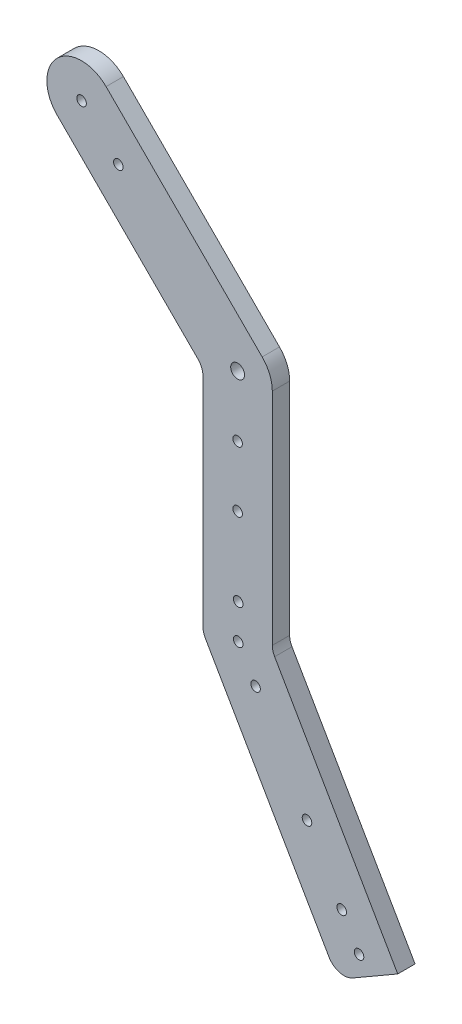
ISO-10303-21;
HEADER;
FILE_DESCRIPTION(('STEP AP214'),'2;1');
FILE_NAME('part.step','',(''),(''),'','','');
FILE_SCHEMA(('AUTOMOTIVE_DESIGN { 1 0 10303 214 1 1 1 1 }'));
ENDSEC;
DATA;
#1=APPLICATION_CONTEXT('core data for automotive mechanical design processes');
#2=APPLICATION_PROTOCOL_DEFINITION('international standard','automotive_design',2000,#1);
#3=PRODUCT_CONTEXT('',#1,'mechanical');
#4=PRODUCT('Part','Part','',(#3));
#5=PRODUCT_RELATED_PRODUCT_CATEGORY('part','',(#4));
#6=PRODUCT_DEFINITION_FORMATION('','',#4);
#7=PRODUCT_DEFINITION_CONTEXT('part definition',#1,'design');
#8=PRODUCT_DEFINITION('design','',#6,#7);
#9=PRODUCT_DEFINITION_SHAPE('','',#8);
#10=(LENGTH_UNIT() NAMED_UNIT(*) SI_UNIT(.MILLI.,.METRE.));
#11=(NAMED_UNIT(*) PLANE_ANGLE_UNIT() SI_UNIT($,.RADIAN.));
#12=(NAMED_UNIT(*) SI_UNIT($,.STERADIAN.) SOLID_ANGLE_UNIT());
#13=UNCERTAINTY_MEASURE_WITH_UNIT(LENGTH_MEASURE(1.E-05),#10,'distance_accuracy_value','');
#14=(GEOMETRIC_REPRESENTATION_CONTEXT(3) GLOBAL_UNCERTAINTY_ASSIGNED_CONTEXT((#13)) GLOBAL_UNIT_ASSIGNED_CONTEXT((#10,
#11,#12)) REPRESENTATION_CONTEXT('',''));
#15=CARTESIAN_POINT('',(0.,0.,0.));
#16=DIRECTION('',(0.,0.,1.));
#17=DIRECTION('',(1.,0.,0.));
#18=AXIS2_PLACEMENT_3D('',#15,#16,#17);
#19=CARTESIAN_POINT('',(0.,0.,10.));
#20=DIRECTION('',(0.,0.,1.));
#21=DIRECTION('',(1.,0.,0.));
#22=AXIS2_PLACEMENT_3D('',#19,#20,#21);
#23=PLANE('',#22);
#24=CARTESIAN_POINT('',(0.340741737109289,145.091301473286,10.));
#25=DIRECTION('',(0.,0.,1.));
#26=DIRECTION('',(1.,0.,0.));
#27=AXIS2_PLACEMENT_3D('',#24,#25,#26);
#28=CIRCLE('',#27,2.75);
#29=CARTESIAN_POINT('',(3.09074173710929,145.091301473286,10.));
#30=VERTEX_POINT('',#29);
#31=EDGE_CURVE('E285',#30,#30,#28,.T.);
#32=ORIENTED_EDGE('',*,*,#31,.F.);
#33=EDGE_LOOP('',(#32));
#34=FACE_BOUND('',#33,.T.);
#35=CARTESIAN_POINT('',(0.340741737109289,125.091301473286,10.));
#36=DIRECTION('',(0.,0.,1.));
#37=DIRECTION('',(1.,0.,0.));
#38=AXIS2_PLACEMENT_3D('',#35,#36,#37);
#39=CIRCLE('',#38,2.75);
#40=CARTESIAN_POINT('',(3.09074173710929,125.091301473286,10.));
#41=VERTEX_POINT('',#40);
#42=EDGE_CURVE('E290',#41,#41,#39,.T.);
#43=ORIENTED_EDGE('',*,*,#42,.F.);
#44=EDGE_LOOP('',(#43));
#45=FACE_BOUND('',#44,.T.);
#46=CARTESIAN_POINT('',(10.3407417371093,107.770793397597,10.));
#47=DIRECTION('',(0.,0.,1.));
#48=DIRECTION('',(1.,0.,0.));
#49=AXIS2_PLACEMENT_3D('',#46,#47,#48);
#50=CIRCLE('',#49,2.75000000000001);
#51=CARTESIAN_POINT('',(13.0907417371093,107.770793397597,10.));
#52=VERTEX_POINT('',#51);
#53=EDGE_CURVE('E293',#52,#52,#50,.T.);
#54=ORIENTED_EDGE('',*,*,#53,.F.);
#55=EDGE_LOOP('',(#54));
#56=FACE_BOUND('',#55,.T.);
#57=CARTESIAN_POINT('',(39.9999999999999,55.7179676972447,10.));
#58=DIRECTION('',(0.,0.,1.));
#59=DIRECTION('',(1.,0.,0.));
#60=AXIS2_PLACEMENT_3D('',#57,#58,#59);
#61=CIRCLE('',#60,2.75);
#62=CARTESIAN_POINT('',(42.7499999999999,55.7179676972447,10.));
#63=VERTEX_POINT('',#62);
#64=EDGE_CURVE('E282',#63,#63,#61,.T.);
#65=ORIENTED_EDGE('',*,*,#64,.F.);
#66=EDGE_LOOP('',(#65));
#67=FACE_BOUND('',#66,.T.);
#68=CARTESIAN_POINT('',(-89.9999999999998,350.,10.));
#69=DIRECTION('',(0.,0.,1.));
#70=DIRECTION('',(1.,0.,0.));
#71=AXIS2_PLACEMENT_3D('',#68,#69,#70);
#72=CIRCLE('',#71,2.75000000000001);
#73=CARTESIAN_POINT('',(-87.2499999999998,350.,10.));
#74=VERTEX_POINT('',#73);
#75=EDGE_CURVE('E277',#74,#74,#72,.T.);
#76=ORIENTED_EDGE('',*,*,#75,.F.);
#77=EDGE_LOOP('',(#76));
#78=FACE_BOUND('',#77,.T.);
#79=CARTESIAN_POINT('',(-68.7867965644034,328.786796564403,10.));
#80=DIRECTION('',(0.,0.,1.));
#81=DIRECTION('',(1.,0.,0.));
#82=AXIS2_PLACEMENT_3D('',#79,#80,#81);
#83=CIRCLE('',#82,2.75000000000001);
#84=CARTESIAN_POINT('',(-66.0367965644034,328.786796564403,10.));
#85=VERTEX_POINT('',#84);
#86=EDGE_CURVE('E270',#85,#85,#83,.T.);
#87=ORIENTED_EDGE('',*,*,#86,.F.);
#88=EDGE_LOOP('',(#87));
#89=FACE_BOUND('',#88,.T.);
#90=CARTESIAN_POINT('',(59.9999999999999,21.0769515458671,10.));
#91=DIRECTION('',(0.,0.,1.));
#92=DIRECTION('',(1.,0.,0.));
#93=AXIS2_PLACEMENT_3D('',#90,#91,#92);
#94=CIRCLE('',#93,2.75000000000002);
#95=CARTESIAN_POINT('',(62.7499999999999,21.0769515458671,10.));
#96=VERTEX_POINT('',#95);
#97=EDGE_CURVE('E169',#96,#96,#94,.T.);
#98=ORIENTED_EDGE('',*,*,#97,.F.);
#99=EDGE_LOOP('',(#98));
#100=FACE_BOUND('',#99,.T.);
#101=CARTESIAN_POINT('',(70.,3.7564434701784,10.));
#102=DIRECTION('',(0.,0.,1.));
#103=DIRECTION('',(1.,0.,0.));
#104=AXIS2_PLACEMENT_3D('',#101,#102,#103);
#105=CIRCLE('',#104,2.75000000000008);
#106=CARTESIAN_POINT('',(72.7500000000001,3.7564434701784,10.));
#107=VERTEX_POINT('',#106);
#108=EDGE_CURVE('E164',#107,#107,#105,.T.);
#109=ORIENTED_EDGE('',*,*,#108,.F.);
#110=EDGE_LOOP('',(#109));
#111=FACE_BOUND('',#110,.T.);
#112=CARTESIAN_POINT('',(0.,190.,10.));
#113=DIRECTION('',(0.,0.,1.));
#114=DIRECTION('',(1.,0.,0.));
#115=AXIS2_PLACEMENT_3D('',#112,#113,#114);
#116=CIRCLE('',#115,2.75);
#117=CARTESIAN_POINT('',(2.75000000000001,190.,10.));
#118=VERTEX_POINT('',#117);
#119=EDGE_CURVE('E177',#118,#118,#116,.T.);
#120=ORIENTED_EDGE('',*,*,#119,.F.);
#121=EDGE_LOOP('',(#120));
#122=FACE_BOUND('',#121,.T.);
#123=CARTESIAN_POINT('',(0.,225.,10.));
#124=DIRECTION('',(0.,0.,1.));
#125=DIRECTION('',(1.,0.,0.));
#126=AXIS2_PLACEMENT_3D('',#123,#124,#125);
#127=CIRCLE('',#126,2.75);
#128=CARTESIAN_POINT('',(2.75,225.,10.));
#129=VERTEX_POINT('',#128);
#130=EDGE_CURVE('E172',#129,#129,#127,.T.);
#131=ORIENTED_EDGE('',*,*,#130,.F.);
#132=EDGE_LOOP('',(#131));
#133=FACE_BOUND('',#132,.T.);
#134=CARTESIAN_POINT('',(0.,260.,10.));
#135=DIRECTION('',(0.,0.,1.));
#136=DIRECTION('',(1.,0.,0.));
#137=AXIS2_PLACEMENT_3D('',#134,#135,#136);
#138=CIRCLE('',#137,4.);
#139=CARTESIAN_POINT('',(4.,260.,10.));
#140=VERTEX_POINT('',#139);
#141=EDGE_CURVE('E176',#140,#140,#138,.T.);
#142=ORIENTED_EDGE('',*,*,#141,.F.);
#143=EDGE_LOOP('',(#142));
#144=FACE_BOUND('',#143,.T.);
#145=DIRECTION('',(-0.707106781186548,0.707106781186548,0.));
#146=VECTOR('',#145,1.);
#147=CARTESIAN_POINT('',(144.142135623731,144.142135623731,10.));
#148=LINE('',#147,#146);
#149=CARTESIAN_POINT('',(14.142135623731,274.142135623731,10.));
#150=VERTEX_POINT('',#149);
#151=CARTESIAN_POINT('',(-75.8578643762689,364.142135623731,10.));
#152=VERTEX_POINT('',#151);
#153=EDGE_CURVE('E154',#150,#152,#148,.T.);
#154=ORIENTED_EDGE('',*,*,#153,.T.);
#155=CARTESIAN_POINT('',(-89.9999999999998,350.,10.));
#156=DIRECTION('',(0.,0.,1.));
#157=DIRECTION('',(1.,0.,0.));
#158=AXIS2_PLACEMENT_3D('',#155,#156,#157);
#159=CIRCLE('',#158,19.9999999999999);
#160=CARTESIAN_POINT('',(-104.142135623731,335.857864376269,10.));
#161=VERTEX_POINT('',#160);
#162=EDGE_CURVE('E132',#152,#161,#159,.T.);
#163=ORIENTED_EDGE('',*,*,#162,.T.);
#164=DIRECTION('',(-0.707106781186548,0.707106781186548,0.));
#165=VECTOR('',#164,1.);
#166=CARTESIAN_POINT('',(115.857864376269,115.857864376269,10.));
#167=LINE('',#166,#165);
#168=CARTESIAN_POINT('',(-22.9289321881345,254.644660940673,10.));
#169=VERTEX_POINT('',#168);
#170=EDGE_CURVE('E157',#169,#161,#167,.T.);
#171=ORIENTED_EDGE('',*,*,#170,.F.);
#172=CARTESIAN_POINT('',(-30.,247.573593128807,10.));
#173=DIRECTION('',(0.,0.,1.));
#174=DIRECTION('',(1.,0.,0.));
#175=AXIS2_PLACEMENT_3D('',#172,#173,#174);
#176=CIRCLE('',#175,10.);
#177=CARTESIAN_POINT('',(-20.,247.573593128807,10.));
#178=VERTEX_POINT('',#177);
#179=EDGE_CURVE('E43',#169,#178,#176,.F.);
#180=ORIENTED_EDGE('',*,*,#179,.T.);
#181=DIRECTION('',(0.,1.,0.));
#182=VECTOR('',#181,1.);
#183=CARTESIAN_POINT('',(-20.,0.,10.));
#184=LINE('',#183,#182);
#185=CARTESIAN_POINT('',(-20.,122.320508075689,10.));
#186=VERTEX_POINT('',#185);
#187=EDGE_CURVE('E207',#186,#178,#184,.T.);
#188=ORIENTED_EDGE('',*,*,#187,.F.);
#189=CARTESIAN_POINT('',(-10.,122.320508075689,10.));
#190=DIRECTION('',(0.,0.,1.));
#191=DIRECTION('',(1.,0.,0.));
#192=AXIS2_PLACEMENT_3D('',#189,#190,#191);
#193=CIRCLE('',#192,10.);
#194=CARTESIAN_POINT('',(-18.6602540378444,117.320508075689,10.));
#195=VERTEX_POINT('',#194);
#196=EDGE_CURVE('E237',#186,#195,#193,.T.);
#197=ORIENTED_EDGE('',*,*,#196,.T.);
#198=DIRECTION('',(0.499999999999995,-0.866025403784442,0.));
#199=VECTOR('',#198,1.);
#200=CARTESIAN_POINT('',(36.8060796608382,21.2499999999994,10.));
#201=LINE('',#200,#199);
#202=CARTESIAN_POINT('',(52.6794919243104,-6.24355652982175,10.));
#203=VERTEX_POINT('',#202);
#204=EDGE_CURVE('E209',#195,#203,#201,.T.);
#205=ORIENTED_EDGE('',*,*,#204,.T.);
#206=CARTESIAN_POINT('',(61.3397459621549,-1.2435565298218,10.));
#207=DIRECTION('',(0.,0.,1.));
#208=DIRECTION('',(1.,0.,0.));
#209=AXIS2_PLACEMENT_3D('',#206,#207,#208);
#210=CIRCLE('',#209,10.);
#211=CARTESIAN_POINT('',(66.3397459621548,-9.90381056766621,10.));
#212=VERTEX_POINT('',#211);
#213=EDGE_CURVE('E239',#203,#212,#210,.T.);
#214=ORIENTED_EDGE('',*,*,#213,.T.);
#215=DIRECTION('',(-0.866025403784442,-0.499999999999995,0.));
#216=VECTOR('',#215,1.);
#217=CARTESIAN_POINT('',(20.8734122634722,-36.1538105676656,10.));
#218=LINE('',#217,#216);
#219=CARTESIAN_POINT('',(92.3205080756881,5.09618943233364,10.));
#220=VERTEX_POINT('',#219);
#221=EDGE_CURVE('E199',#220,#212,#218,.T.);
#222=ORIENTED_EDGE('',*,*,#221,.F.);
#223=DIRECTION('',(0.499999999999995,-0.866025403784442,0.));
#224=VECTOR('',#223,1.);
#225=CARTESIAN_POINT('',(71.4470958122159,41.2499999999993,10.));
#226=LINE('',#225,#224);
#227=CARTESIAN_POINT('',(21.3397459621556,128.038475772934,10.));
#228=VERTEX_POINT('',#227);
#229=EDGE_CURVE('E202',#228,#220,#226,.T.);
#230=ORIENTED_EDGE('',*,*,#229,.F.);
#231=CARTESIAN_POINT('',(30.,133.038475772934,10.));
#232=DIRECTION('',(0.,0.,1.));
#233=DIRECTION('',(1.,0.,0.));
#234=AXIS2_PLACEMENT_3D('',#231,#232,#233);
#235=CIRCLE('',#234,10.);
#236=CARTESIAN_POINT('',(20.,133.038475772934,10.));
#237=VERTEX_POINT('',#236);
#238=EDGE_CURVE('E250',#228,#237,#235,.F.);
#239=ORIENTED_EDGE('',*,*,#238,.T.);
#240=DIRECTION('',(0.,1.,0.));
#241=VECTOR('',#240,1.);
#242=CARTESIAN_POINT('',(20.,0.,10.));
#243=LINE('',#242,#241);
#244=CARTESIAN_POINT('',(20.,260.,10.));
#245=VERTEX_POINT('',#244);
#246=EDGE_CURVE('E205',#237,#245,#243,.T.);
#247=ORIENTED_EDGE('',*,*,#246,.T.);
#248=CARTESIAN_POINT('',(0.,260.,10.));
#249=DIRECTION('',(0.,0.,1.));
#250=DIRECTION('',(1.,0.,0.));
#251=AXIS2_PLACEMENT_3D('',#248,#249,#250);
#252=CIRCLE('',#251,20.);
#253=EDGE_CURVE('E189',#245,#150,#252,.T.);
#254=ORIENTED_EDGE('',*,*,#253,.T.);
#255=EDGE_LOOP('',(#154,#163,#171,#180,#188,#197,#205,#214,#222,#230,#239,#247,#254));
#256=FACE_BOUND('',#255,.T.);
#257=ADVANCED_FACE('F35',(#34,#45,#56,#67,#78,#89,#100,#111,#122,#133,#144,#256),#23,.T.);
#258=CARTESIAN_POINT('',(0.,0.,0.));
#259=DIRECTION('',(0.,0.,1.));
#260=DIRECTION('',(1.,0.,0.));
#261=AXIS2_PLACEMENT_3D('',#258,#259,#260);
#262=PLANE('',#261);
#263=CARTESIAN_POINT('',(0.340741737109289,145.091301473286,0.));
#264=DIRECTION('',(0.,0.,1.));
#265=DIRECTION('',(1.,0.,0.));
#266=AXIS2_PLACEMENT_3D('',#263,#264,#265);
#267=CIRCLE('',#266,2.75);
#268=CARTESIAN_POINT('',(3.09074173710929,145.091301473286,0.));
#269=VERTEX_POINT('',#268);
#270=EDGE_CURVE('E296',#269,#269,#267,.T.);
#271=ORIENTED_EDGE('',*,*,#270,.T.);
#272=EDGE_LOOP('',(#271));
#273=FACE_BOUND('',#272,.T.);
#274=CARTESIAN_POINT('',(0.340741737109289,125.091301473286,0.));
#275=DIRECTION('',(0.,0.,1.));
#276=DIRECTION('',(1.,0.,0.));
#277=AXIS2_PLACEMENT_3D('',#274,#275,#276);
#278=CIRCLE('',#277,2.75);
#279=CARTESIAN_POINT('',(3.09074173710929,125.091301473286,0.));
#280=VERTEX_POINT('',#279);
#281=EDGE_CURVE('E300',#280,#280,#278,.T.);
#282=ORIENTED_EDGE('',*,*,#281,.T.);
#283=EDGE_LOOP('',(#282));
#284=FACE_BOUND('',#283,.T.);
#285=CARTESIAN_POINT('',(10.3407417371093,107.770793397597,0.));
#286=DIRECTION('',(0.,0.,1.));
#287=DIRECTION('',(1.,0.,0.));
#288=AXIS2_PLACEMENT_3D('',#285,#286,#287);
#289=CIRCLE('',#288,2.75000000000001);
#290=CARTESIAN_POINT('',(13.0907417371093,107.770793397597,0.));
#291=VERTEX_POINT('',#290);
#292=EDGE_CURVE('E297',#291,#291,#289,.T.);
#293=ORIENTED_EDGE('',*,*,#292,.T.);
#294=EDGE_LOOP('',(#293));
#295=FACE_BOUND('',#294,.T.);
#296=CARTESIAN_POINT('',(39.9999999999999,55.7179676972447,0.));
#297=DIRECTION('',(0.,0.,1.));
#298=DIRECTION('',(1.,0.,0.));
#299=AXIS2_PLACEMENT_3D('',#296,#297,#298);
#300=CIRCLE('',#299,2.75);
#301=CARTESIAN_POINT('',(42.7499999999999,55.7179676972447,0.));
#302=VERTEX_POINT('',#301);
#303=EDGE_CURVE('E274',#302,#302,#300,.T.);
#304=ORIENTED_EDGE('',*,*,#303,.T.);
#305=EDGE_LOOP('',(#304));
#306=FACE_BOUND('',#305,.T.);
#307=CARTESIAN_POINT('',(-89.9999999999998,350.,0.));
#308=DIRECTION('',(0.,0.,1.));
#309=DIRECTION('',(1.,0.,0.));
#310=AXIS2_PLACEMENT_3D('',#307,#308,#309);
#311=CIRCLE('',#310,2.75000000000001);
#312=CARTESIAN_POINT('',(-87.2499999999998,350.,0.));
#313=VERTEX_POINT('',#312);
#314=EDGE_CURVE('E268',#313,#313,#311,.T.);
#315=ORIENTED_EDGE('',*,*,#314,.T.);
#316=EDGE_LOOP('',(#315));
#317=FACE_BOUND('',#316,.T.);
#318=CARTESIAN_POINT('',(-68.7867965644034,328.786796564403,0.));
#319=DIRECTION('',(0.,0.,1.));
#320=DIRECTION('',(1.,0.,0.));
#321=AXIS2_PLACEMENT_3D('',#318,#319,#320);
#322=CIRCLE('',#321,2.75000000000001);
#323=CARTESIAN_POINT('',(-66.0367965644034,328.786796564403,0.));
#324=VERTEX_POINT('',#323);
#325=EDGE_CURVE('E273',#324,#324,#322,.T.);
#326=ORIENTED_EDGE('',*,*,#325,.T.);
#327=EDGE_LOOP('',(#326));
#328=FACE_BOUND('',#327,.T.);
#329=CARTESIAN_POINT('',(0.,260.,0.));
#330=DIRECTION('',(0.,0.,1.));
#331=DIRECTION('',(1.,0.,0.));
#332=AXIS2_PLACEMENT_3D('',#329,#330,#331);
#333=CIRCLE('',#332,4.);
#334=CARTESIAN_POINT('',(4.,260.,0.));
#335=VERTEX_POINT('',#334);
#336=EDGE_CURVE('E185',#335,#335,#333,.T.);
#337=ORIENTED_EDGE('',*,*,#336,.T.);
#338=EDGE_LOOP('',(#337));
#339=FACE_BOUND('',#338,.T.);
#340=CARTESIAN_POINT('',(0.,225.,0.));
#341=DIRECTION('',(0.,0.,1.));
#342=DIRECTION('',(1.,0.,0.));
#343=AXIS2_PLACEMENT_3D('',#340,#341,#342);
#344=CIRCLE('',#343,2.75);
#345=CARTESIAN_POINT('',(2.75,225.,0.));
#346=VERTEX_POINT('',#345);
#347=EDGE_CURVE('E180',#346,#346,#344,.T.);
#348=ORIENTED_EDGE('',*,*,#347,.T.);
#349=EDGE_LOOP('',(#348));
#350=FACE_BOUND('',#349,.T.);
#351=CARTESIAN_POINT('',(0.,190.,0.));
#352=DIRECTION('',(0.,0.,1.));
#353=DIRECTION('',(1.,0.,0.));
#354=AXIS2_PLACEMENT_3D('',#351,#352,#353);
#355=CIRCLE('',#354,2.75);
#356=CARTESIAN_POINT('',(2.75000000000001,190.,0.));
#357=VERTEX_POINT('',#356);
#358=EDGE_CURVE('E173',#357,#357,#355,.T.);
#359=ORIENTED_EDGE('',*,*,#358,.T.);
#360=EDGE_LOOP('',(#359));
#361=FACE_BOUND('',#360,.T.);
#362=CARTESIAN_POINT('',(70.,3.7564434701784,0.));
#363=DIRECTION('',(0.,0.,1.));
#364=DIRECTION('',(1.,0.,0.));
#365=AXIS2_PLACEMENT_3D('',#362,#363,#364);
#366=CIRCLE('',#365,2.75000000000008);
#367=CARTESIAN_POINT('',(72.7500000000001,3.7564434701784,0.));
#368=VERTEX_POINT('',#367);
#369=EDGE_CURVE('E152',#368,#368,#366,.T.);
#370=ORIENTED_EDGE('',*,*,#369,.T.);
#371=EDGE_LOOP('',(#370));
#372=FACE_BOUND('',#371,.T.);
#373=CARTESIAN_POINT('',(59.9999999999999,21.0769515458671,0.));
#374=DIRECTION('',(0.,0.,1.));
#375=DIRECTION('',(1.,0.,0.));
#376=AXIS2_PLACEMENT_3D('',#373,#374,#375);
#377=CIRCLE('',#376,2.75000000000002);
#378=CARTESIAN_POINT('',(62.7499999999999,21.0769515458671,0.));
#379=VERTEX_POINT('',#378);
#380=EDGE_CURVE('E161',#379,#379,#377,.T.);
#381=ORIENTED_EDGE('',*,*,#380,.T.);
#382=EDGE_LOOP('',(#381));
#383=FACE_BOUND('',#382,.T.);
#384=CARTESIAN_POINT('',(-89.9999999999998,350.,0.));
#385=DIRECTION('',(0.,0.,1.));
#386=DIRECTION('',(1.,0.,0.));
#387=AXIS2_PLACEMENT_3D('',#384,#385,#386);
#388=CIRCLE('',#387,19.9999999999999);
#389=CARTESIAN_POINT('',(-75.8578643762689,364.142135623731,0.));
#390=VERTEX_POINT('',#389);
#391=CARTESIAN_POINT('',(-104.142135623731,335.857864376269,0.));
#392=VERTEX_POINT('',#391);
#393=EDGE_CURVE('E50',#390,#392,#388,.T.);
#394=ORIENTED_EDGE('',*,*,#393,.F.);
#395=DIRECTION('',(-0.707106781186548,0.707106781186548,0.));
#396=VECTOR('',#395,1.);
#397=CARTESIAN_POINT('',(144.142135623731,144.142135623731,0.));
#398=LINE('',#397,#396);
#399=CARTESIAN_POINT('',(14.142135623731,274.142135623731,0.));
#400=VERTEX_POINT('',#399);
#401=EDGE_CURVE('E143',#400,#390,#398,.T.);
#402=ORIENTED_EDGE('',*,*,#401,.F.);
#403=CARTESIAN_POINT('',(0.,260.,0.));
#404=DIRECTION('',(0.,0.,1.));
#405=DIRECTION('',(1.,0.,0.));
#406=AXIS2_PLACEMENT_3D('',#403,#404,#405);
#407=CIRCLE('',#406,20.);
#408=CARTESIAN_POINT('',(20.,260.,0.));
#409=VERTEX_POINT('',#408);
#410=EDGE_CURVE('E188',#409,#400,#407,.T.);
#411=ORIENTED_EDGE('',*,*,#410,.F.);
#412=DIRECTION('',(0.,1.,0.));
#413=VECTOR('',#412,1.);
#414=CARTESIAN_POINT('',(20.,0.,0.));
#415=LINE('',#414,#413);
#416=CARTESIAN_POINT('',(20.,133.038475772934,0.));
#417=VERTEX_POINT('',#416);
#418=EDGE_CURVE('E217',#417,#409,#415,.T.);
#419=ORIENTED_EDGE('',*,*,#418,.F.);
#420=CARTESIAN_POINT('',(30.,133.038475772934,0.));
#421=DIRECTION('',(0.,0.,1.));
#422=DIRECTION('',(1.,0.,0.));
#423=AXIS2_PLACEMENT_3D('',#420,#421,#422);
#424=CIRCLE('',#423,10.);
#425=CARTESIAN_POINT('',(21.3397459621556,128.038475772934,0.));
#426=VERTEX_POINT('',#425);
#427=EDGE_CURVE('E248',#417,#426,#424,.T.);
#428=ORIENTED_EDGE('',*,*,#427,.T.);
#429=DIRECTION('',(0.499999999999995,-0.866025403784442,0.));
#430=VECTOR('',#429,1.);
#431=CARTESIAN_POINT('',(71.4470958122159,41.2499999999993,0.));
#432=LINE('',#431,#430);
#433=CARTESIAN_POINT('',(92.3205080756881,5.09618943233364,0.));
#434=VERTEX_POINT('',#433);
#435=EDGE_CURVE('E215',#426,#434,#432,.T.);
#436=ORIENTED_EDGE('',*,*,#435,.T.);
#437=DIRECTION('',(-0.866025403784442,-0.499999999999995,0.));
#438=VECTOR('',#437,1.);
#439=CARTESIAN_POINT('',(20.8734122634722,-36.1538105676656,0.));
#440=LINE('',#439,#438);
#441=CARTESIAN_POINT('',(66.3397459621548,-9.90381056766621,0.));
#442=VERTEX_POINT('',#441);
#443=EDGE_CURVE('E198',#434,#442,#440,.T.);
#444=ORIENTED_EDGE('',*,*,#443,.T.);
#445=CARTESIAN_POINT('',(61.3397459621549,-1.2435565298218,0.));
#446=DIRECTION('',(0.,0.,1.));
#447=DIRECTION('',(1.,0.,0.));
#448=AXIS2_PLACEMENT_3D('',#445,#446,#447);
#449=CIRCLE('',#448,10.);
#450=CARTESIAN_POINT('',(52.6794919243104,-6.24355652982175,0.));
#451=VERTEX_POINT('',#450);
#452=EDGE_CURVE('E230',#442,#451,#449,.F.);
#453=ORIENTED_EDGE('',*,*,#452,.T.);
#454=DIRECTION('',(0.499999999999995,-0.866025403784442,0.));
#455=VECTOR('',#454,1.);
#456=CARTESIAN_POINT('',(36.8060796608382,21.2499999999994,0.));
#457=LINE('',#456,#455);
#458=CARTESIAN_POINT('',(-18.6602540378444,117.320508075689,0.));
#459=VERTEX_POINT('',#458);
#460=EDGE_CURVE('E203',#459,#451,#457,.T.);
#461=ORIENTED_EDGE('',*,*,#460,.F.);
#462=CARTESIAN_POINT('',(-10.,122.320508075689,0.));
#463=DIRECTION('',(0.,0.,1.));
#464=DIRECTION('',(1.,0.,0.));
#465=AXIS2_PLACEMENT_3D('',#462,#463,#464);
#466=CIRCLE('',#465,10.);
#467=CARTESIAN_POINT('',(-20.,122.320508075689,0.));
#468=VERTEX_POINT('',#467);
#469=EDGE_CURVE('E228',#459,#468,#466,.F.);
#470=ORIENTED_EDGE('',*,*,#469,.T.);
#471=DIRECTION('',(0.,1.,0.));
#472=VECTOR('',#471,1.);
#473=CARTESIAN_POINT('',(-20.,0.,0.));
#474=LINE('',#473,#472);
#475=CARTESIAN_POINT('',(-20.,247.573593128807,0.));
#476=VERTEX_POINT('',#475);
#477=EDGE_CURVE('E219',#468,#476,#474,.T.);
#478=ORIENTED_EDGE('',*,*,#477,.T.);
#479=CARTESIAN_POINT('',(-30.,247.573593128807,0.));
#480=DIRECTION('',(0.,0.,1.));
#481=DIRECTION('',(1.,0.,0.));
#482=AXIS2_PLACEMENT_3D('',#479,#480,#481);
#483=CIRCLE('',#482,10.);
#484=CARTESIAN_POINT('',(-22.9289321881345,254.644660940673,0.));
#485=VERTEX_POINT('',#484);
#486=EDGE_CURVE('E12',#476,#485,#483,.T.);
#487=ORIENTED_EDGE('',*,*,#486,.T.);
#488=DIRECTION('',(-0.707106781186548,0.707106781186548,0.));
#489=VECTOR('',#488,1.);
#490=CARTESIAN_POINT('',(115.857864376269,115.857864376269,0.));
#491=LINE('',#490,#489);
#492=EDGE_CURVE('E146',#485,#392,#491,.T.);
#493=ORIENTED_EDGE('',*,*,#492,.T.);
#494=EDGE_LOOP('',(#394,#402,#411,#419,#428,#436,#444,#453,#461,#470,#478,#487,#493));
#495=FACE_BOUND('',#494,.T.);
#496=ADVANCED_FACE('F141',(#273,#284,#295,#306,#317,#328,#339,#350,#361,#372,#383,#495),#262,.F.);
#497=CARTESIAN_POINT('',(144.142135623731,144.142135623731,0.));
#498=DIRECTION('',(0.707106781186548,0.707106781186548,0.));
#499=DIRECTION('',(-0.707106781186548,0.707106781186548,0.));
#500=AXIS2_PLACEMENT_3D('',#497,#498,#499);
#501=PLANE('',#500);
#502=ORIENTED_EDGE('',*,*,#401,.T.);
#503=DIRECTION('',(0.,0.,1.));
#504=VECTOR('',#503,1.);
#505=CARTESIAN_POINT('',(-75.8578643762689,364.142135623731,0.));
#506=LINE('',#505,#504);
#507=EDGE_CURVE('E129',#390,#152,#506,.T.);
#508=ORIENTED_EDGE('',*,*,#507,.T.);
#509=ORIENTED_EDGE('',*,*,#153,.F.);
#510=DIRECTION('',(0.,0.,1.));
#511=VECTOR('',#510,1.);
#512=CARTESIAN_POINT('',(14.142135623731,274.142135623731,0.));
#513=LINE('',#512,#511);
#514=EDGE_CURVE('E150',#400,#150,#513,.T.);
#515=ORIENTED_EDGE('',*,*,#514,.F.);
#516=EDGE_LOOP('',(#502,#508,#509,#515));
#517=FACE_BOUND('',#516,.T.);
#518=ADVANCED_FACE('F148',(#517),#501,.T.);
#519=CARTESIAN_POINT('',(115.857864376269,115.857864376269,0.));
#520=DIRECTION('',(0.707106781186548,0.707106781186548,0.));
#521=DIRECTION('',(-0.707106781186548,0.707106781186548,0.));
#522=AXIS2_PLACEMENT_3D('',#519,#520,#521);
#523=PLANE('',#522);
#524=DIRECTION('',(0.,0.,1.));
#525=VECTOR('',#524,1.);
#526=CARTESIAN_POINT('',(-104.142135623731,335.857864376269,0.));
#527=LINE('',#526,#525);
#528=EDGE_CURVE('E136',#392,#161,#527,.T.);
#529=ORIENTED_EDGE('',*,*,#528,.F.);
#530=ORIENTED_EDGE('',*,*,#492,.F.);
#531=DIRECTION('',(0.,0.,1.));
#532=VECTOR('',#531,1.);
#533=CARTESIAN_POINT('',(-22.9289321881345,254.644660940673,0.));
#534=LINE('',#533,#532);
#535=EDGE_CURVE('E252',#485,#169,#534,.T.);
#536=ORIENTED_EDGE('',*,*,#535,.T.);
#537=ORIENTED_EDGE('',*,*,#170,.T.);
#538=EDGE_LOOP('',(#529,#530,#536,#537));
#539=FACE_BOUND('',#538,.T.);
#540=ADVANCED_FACE('F265',(#539),#523,.F.);
#541=CARTESIAN_POINT('',(-20.,0.,10.));
#542=DIRECTION('',(-1.,0.,0.));
#543=DIRECTION('',(0.,0.,1.));
#544=AXIS2_PLACEMENT_3D('',#541,#542,#543);
#545=PLANE('',#544);
#546=ORIENTED_EDGE('',*,*,#187,.T.);
#547=DIRECTION('',(0.,0.,1.));
#548=VECTOR('',#547,1.);
#549=CARTESIAN_POINT('',(-20.,247.573593128807,10.));
#550=LINE('',#549,#548);
#551=EDGE_CURVE('E58',#178,#476,#550,.F.);
#552=ORIENTED_EDGE('',*,*,#551,.T.);
#553=ORIENTED_EDGE('',*,*,#477,.F.);
#554=DIRECTION('',(0.,0.,-1.));
#555=VECTOR('',#554,1.);
#556=CARTESIAN_POINT('',(-20.,122.320508075689,10.));
#557=LINE('',#556,#555);
#558=EDGE_CURVE('E241',#468,#186,#557,.F.);
#559=ORIENTED_EDGE('',*,*,#558,.T.);
#560=EDGE_LOOP('',(#546,#552,#553,#559));
#561=FACE_BOUND('',#560,.T.);
#562=ADVANCED_FACE('F261',(#561),#545,.T.);
#563=CARTESIAN_POINT('',(20.8734122634722,-36.1538105676656,10.));
#564=DIRECTION('',(0.499999999999995,-0.866025403784442,0.));
#565=DIRECTION('',(0.866025403784442,0.499999999999995,0.));
#566=AXIS2_PLACEMENT_3D('',#563,#564,#565);
#567=PLANE('',#566);
#568=ORIENTED_EDGE('',*,*,#221,.T.);
#569=DIRECTION('',(0.,0.,-1.));
#570=VECTOR('',#569,1.);
#571=CARTESIAN_POINT('',(66.3397459621548,-9.90381056766621,0.));
#572=LINE('',#571,#570);
#573=EDGE_CURVE('E225',#212,#442,#572,.T.);
#574=ORIENTED_EDGE('',*,*,#573,.T.);
#575=ORIENTED_EDGE('',*,*,#443,.F.);
#576=DIRECTION('',(0.,0.,-1.));
#577=VECTOR('',#576,1.);
#578=CARTESIAN_POINT('',(92.3205080756881,5.09618943233364,10.));
#579=LINE('',#578,#577);
#580=EDGE_CURVE('E212',#220,#434,#579,.T.);
#581=ORIENTED_EDGE('',*,*,#580,.F.);
#582=EDGE_LOOP('',(#568,#574,#575,#581));
#583=FACE_BOUND('',#582,.T.);
#584=ADVANCED_FACE('F340',(#583),#567,.T.);
#585=CARTESIAN_POINT('',(71.4470958122159,41.2499999999993,10.));
#586=DIRECTION('',(0.866025403784442,0.499999999999995,0.));
#587=DIRECTION('',(-0.499999999999995,0.866025403784442,0.));
#588=AXIS2_PLACEMENT_3D('',#585,#586,#587);
#589=PLANE('',#588);
#590=ORIENTED_EDGE('',*,*,#435,.F.);
#591=DIRECTION('',(0.,0.,-1.));
#592=VECTOR('',#591,1.);
#593=CARTESIAN_POINT('',(21.3397459621556,128.038475772934,10.));
#594=LINE('',#593,#592);
#595=EDGE_CURVE('E246',#426,#228,#594,.F.);
#596=ORIENTED_EDGE('',*,*,#595,.T.);
#597=ORIENTED_EDGE('',*,*,#229,.T.);
#598=ORIENTED_EDGE('',*,*,#580,.T.);
#599=EDGE_LOOP('',(#590,#596,#597,#598));
#600=FACE_BOUND('',#599,.T.);
#601=ADVANCED_FACE('F343',(#600),#589,.T.);
#602=CARTESIAN_POINT('',(20.,0.,10.));
#603=DIRECTION('',(-1.,0.,0.));
#604=DIRECTION('',(0.,0.,1.));
#605=AXIS2_PLACEMENT_3D('',#602,#603,#604);
#606=PLANE('',#605);
#607=ORIENTED_EDGE('',*,*,#246,.F.);
#608=DIRECTION('',(0.,0.,-1.));
#609=VECTOR('',#608,1.);
#610=CARTESIAN_POINT('',(20.,133.038475772934,10.));
#611=LINE('',#610,#609);
#612=EDGE_CURVE('E243',#237,#417,#611,.T.);
#613=ORIENTED_EDGE('',*,*,#612,.T.);
#614=ORIENTED_EDGE('',*,*,#418,.T.);
#615=DIRECTION('',(0.,0.,1.));
#616=VECTOR('',#615,1.);
#617=CARTESIAN_POINT('',(20.,260.,0.));
#618=LINE('',#617,#616);
#619=EDGE_CURVE('E191',#409,#245,#618,.T.);
#620=ORIENTED_EDGE('',*,*,#619,.T.);
#621=EDGE_LOOP('',(#607,#613,#614,#620));
#622=FACE_BOUND('',#621,.T.);
#623=ADVANCED_FACE('F336',(#622),#606,.F.);
#624=CARTESIAN_POINT('',(36.8060796608382,21.2499999999994,10.));
#625=DIRECTION('',(0.866025403784442,0.499999999999995,0.));
#626=DIRECTION('',(-0.499999999999995,0.866025403784442,0.));
#627=AXIS2_PLACEMENT_3D('',#624,#625,#626);
#628=PLANE('',#627);
#629=ORIENTED_EDGE('',*,*,#460,.T.);
#630=DIRECTION('',(0.,0.,-1.));
#631=VECTOR('',#630,1.);
#632=CARTESIAN_POINT('',(52.6794919243104,-6.24355652982175,10.));
#633=LINE('',#632,#631);
#634=EDGE_CURVE('E235',#451,#203,#633,.F.);
#635=ORIENTED_EDGE('',*,*,#634,.T.);
#636=ORIENTED_EDGE('',*,*,#204,.F.);
#637=DIRECTION('',(0.,0.,-1.));
#638=VECTOR('',#637,1.);
#639=CARTESIAN_POINT('',(-18.6602540378444,117.320508075689,0.));
#640=LINE('',#639,#638);
#641=EDGE_CURVE('E232',#195,#459,#640,.T.);
#642=ORIENTED_EDGE('',*,*,#641,.T.);
#643=EDGE_LOOP('',(#629,#635,#636,#642));
#644=FACE_BOUND('',#643,.T.);
#645=ADVANCED_FACE('F332',(#644),#628,.F.);
#646=CARTESIAN_POINT('',(61.3397459621549,-1.2435565298218,10.));
#647=DIRECTION('',(0.,0.,1.));
#648=DIRECTION('',(1.,0.,0.));
#649=AXIS2_PLACEMENT_3D('',#646,#647,#648);
#650=CYLINDRICAL_SURFACE('',#649,10.);
#651=ORIENTED_EDGE('',*,*,#213,.F.);
#652=ORIENTED_EDGE('',*,*,#634,.F.);
#653=ORIENTED_EDGE('',*,*,#452,.F.);
#654=ORIENTED_EDGE('',*,*,#573,.F.);
#655=EDGE_LOOP('',(#651,#652,#653,#654));
#656=FACE_BOUND('',#655,.T.);
#657=ADVANCED_FACE('F335',(#656),#650,.T.);
#658=CARTESIAN_POINT('',(-10.,122.320508075689,10.));
#659=DIRECTION('',(0.,0.,1.));
#660=DIRECTION('',(1.,0.,0.));
#661=AXIS2_PLACEMENT_3D('',#658,#659,#660);
#662=CYLINDRICAL_SURFACE('',#661,10.);
#663=ORIENTED_EDGE('',*,*,#196,.F.);
#664=ORIENTED_EDGE('',*,*,#558,.F.);
#665=ORIENTED_EDGE('',*,*,#469,.F.);
#666=ORIENTED_EDGE('',*,*,#641,.F.);
#667=EDGE_LOOP('',(#663,#664,#665,#666));
#668=FACE_BOUND('',#667,.T.);
#669=ADVANCED_FACE('F353',(#668),#662,.T.);
#670=CARTESIAN_POINT('',(30.,133.038475772934,10.));
#671=DIRECTION('',(0.,0.,-1.));
#672=DIRECTION('',(-1.,0.,0.));
#673=AXIS2_PLACEMENT_3D('',#670,#671,#672);
#674=CYLINDRICAL_SURFACE('',#673,10.);
#675=ORIENTED_EDGE('',*,*,#238,.F.);
#676=ORIENTED_EDGE('',*,*,#595,.F.);
#677=ORIENTED_EDGE('',*,*,#427,.F.);
#678=ORIENTED_EDGE('',*,*,#612,.F.);
#679=EDGE_LOOP('',(#675,#676,#677,#678));
#680=FACE_BOUND('',#679,.T.);
#681=ADVANCED_FACE('F356',(#680),#674,.F.);
#682=CARTESIAN_POINT('',(0.,260.,0.));
#683=DIRECTION('',(0.,0.,1.));
#684=DIRECTION('',(1.,0.,0.));
#685=AXIS2_PLACEMENT_3D('',#682,#683,#684);
#686=CYLINDRICAL_SURFACE('',#685,20.);
#687=ORIENTED_EDGE('',*,*,#514,.T.);
#688=ORIENTED_EDGE('',*,*,#253,.F.);
#689=ORIENTED_EDGE('',*,*,#619,.F.);
#690=ORIENTED_EDGE('',*,*,#410,.T.);
#691=EDGE_LOOP('',(#687,#688,#689,#690));
#692=FACE_BOUND('',#691,.T.);
#693=ADVANCED_FACE('F359',(#692),#686,.T.);
#694=CARTESIAN_POINT('',(0.,260.,0.));
#695=DIRECTION('',(0.,0.,1.));
#696=DIRECTION('',(1.,0.,0.));
#697=AXIS2_PLACEMENT_3D('',#694,#695,#696);
#698=CYLINDRICAL_SURFACE('',#697,4.);
#699=ORIENTED_EDGE('',*,*,#336,.F.);
#700=EDGE_LOOP('',(#699));
#701=FACE_BOUND('',#700,.T.);
#702=ORIENTED_EDGE('',*,*,#141,.T.);
#703=EDGE_LOOP('',(#702));
#704=FACE_BOUND('',#703,.T.);
#705=ADVANCED_FACE('F329',(#701,#704),#698,.F.);
#706=CARTESIAN_POINT('',(0.,225.,0.));
#707=DIRECTION('',(0.,0.,1.));
#708=DIRECTION('',(1.,0.,0.));
#709=AXIS2_PLACEMENT_3D('',#706,#707,#708);
#710=CYLINDRICAL_SURFACE('',#709,2.75);
#711=ORIENTED_EDGE('',*,*,#347,.F.);
#712=EDGE_LOOP('',(#711));
#713=FACE_BOUND('',#712,.T.);
#714=ORIENTED_EDGE('',*,*,#130,.T.);
#715=EDGE_LOOP('',(#714));
#716=FACE_BOUND('',#715,.T.);
#717=ADVANCED_FACE('F386',(#713,#716),#710,.F.);
#718=CARTESIAN_POINT('',(0.,190.,0.));
#719=DIRECTION('',(0.,0.,1.));
#720=DIRECTION('',(1.,0.,0.));
#721=AXIS2_PLACEMENT_3D('',#718,#719,#720);
#722=CYLINDRICAL_SURFACE('',#721,2.75);
#723=ORIENTED_EDGE('',*,*,#358,.F.);
#724=EDGE_LOOP('',(#723));
#725=FACE_BOUND('',#724,.T.);
#726=ORIENTED_EDGE('',*,*,#119,.T.);
#727=EDGE_LOOP('',(#726));
#728=FACE_BOUND('',#727,.T.);
#729=ADVANCED_FACE('F391',(#725,#728),#722,.F.);
#730=CARTESIAN_POINT('',(70.,3.7564434701784,0.));
#731=DIRECTION('',(0.,0.,1.));
#732=DIRECTION('',(1.,0.,0.));
#733=AXIS2_PLACEMENT_3D('',#730,#731,#732);
#734=CYLINDRICAL_SURFACE('',#733,2.75000000000008);
#735=ORIENTED_EDGE('',*,*,#108,.T.);
#736=EDGE_LOOP('',(#735));
#737=FACE_BOUND('',#736,.T.);
#738=ORIENTED_EDGE('',*,*,#369,.F.);
#739=EDGE_LOOP('',(#738));
#740=FACE_BOUND('',#739,.T.);
#741=ADVANCED_FACE('F395',(#737,#740),#734,.F.);
#742=CARTESIAN_POINT('',(59.9999999999999,21.0769515458671,0.));
#743=DIRECTION('',(0.,0.,1.));
#744=DIRECTION('',(1.,0.,0.));
#745=AXIS2_PLACEMENT_3D('',#742,#743,#744);
#746=CYLINDRICAL_SURFACE('',#745,2.75000000000002);
#747=ORIENTED_EDGE('',*,*,#97,.T.);
#748=EDGE_LOOP('',(#747));
#749=FACE_BOUND('',#748,.T.);
#750=ORIENTED_EDGE('',*,*,#380,.F.);
#751=EDGE_LOOP('',(#750));
#752=FACE_BOUND('',#751,.T.);
#753=ADVANCED_FACE('F399',(#749,#752),#746,.F.);
#754=CARTESIAN_POINT('',(-30.,247.573593128807,0.));
#755=DIRECTION('',(0.,0.,1.));
#756=DIRECTION('',(1.,0.,0.));
#757=AXIS2_PLACEMENT_3D('',#754,#755,#756);
#758=CYLINDRICAL_SURFACE('',#757,10.);
#759=ORIENTED_EDGE('',*,*,#486,.F.);
#760=ORIENTED_EDGE('',*,*,#551,.F.);
#761=ORIENTED_EDGE('',*,*,#179,.F.);
#762=ORIENTED_EDGE('',*,*,#535,.F.);
#763=EDGE_LOOP('',(#759,#760,#761,#762));
#764=FACE_BOUND('',#763,.T.);
#765=ADVANCED_FACE('F37',(#764),#758,.F.);
#766=CARTESIAN_POINT('',(-89.9999999999998,350.,0.));
#767=DIRECTION('',(0.,0.,1.));
#768=DIRECTION('',(1.,0.,0.));
#769=AXIS2_PLACEMENT_3D('',#766,#767,#768);
#770=CYLINDRICAL_SURFACE('',#769,19.9999999999999);
#771=ORIENTED_EDGE('',*,*,#162,.F.);
#772=ORIENTED_EDGE('',*,*,#507,.F.);
#773=ORIENTED_EDGE('',*,*,#393,.T.);
#774=ORIENTED_EDGE('',*,*,#528,.T.);
#775=EDGE_LOOP('',(#771,#772,#773,#774));
#776=FACE_BOUND('',#775,.T.);
#777=ADVANCED_FACE('F130',(#776),#770,.T.);
#778=CARTESIAN_POINT('',(-68.7867965644034,328.786796564403,0.));
#779=DIRECTION('',(0.,0.,1.));
#780=DIRECTION('',(1.,0.,0.));
#781=AXIS2_PLACEMENT_3D('',#778,#779,#780);
#782=CYLINDRICAL_SURFACE('',#781,2.75000000000001);
#783=ORIENTED_EDGE('',*,*,#325,.F.);
#784=EDGE_LOOP('',(#783));
#785=FACE_BOUND('',#784,.T.);
#786=ORIENTED_EDGE('',*,*,#86,.T.);
#787=EDGE_LOOP('',(#786));
#788=FACE_BOUND('',#787,.T.);
#789=ADVANCED_FACE('F410',(#785,#788),#782,.F.);
#790=CARTESIAN_POINT('',(-89.9999999999998,350.,0.));
#791=DIRECTION('',(0.,0.,1.));
#792=DIRECTION('',(1.,0.,0.));
#793=AXIS2_PLACEMENT_3D('',#790,#791,#792);
#794=CYLINDRICAL_SURFACE('',#793,2.75000000000001);
#795=ORIENTED_EDGE('',*,*,#314,.F.);
#796=EDGE_LOOP('',(#795));
#797=FACE_BOUND('',#796,.T.);
#798=ORIENTED_EDGE('',*,*,#75,.T.);
#799=EDGE_LOOP('',(#798));
#800=FACE_BOUND('',#799,.T.);
#801=ADVANCED_FACE('F413',(#797,#800),#794,.F.);
#802=CARTESIAN_POINT('',(39.9999999999999,55.7179676972447,0.));
#803=DIRECTION('',(0.,0.,1.));
#804=DIRECTION('',(1.,0.,0.));
#805=AXIS2_PLACEMENT_3D('',#802,#803,#804);
#806=CYLINDRICAL_SURFACE('',#805,2.75);
#807=ORIENTED_EDGE('',*,*,#303,.F.);
#808=EDGE_LOOP('',(#807));
#809=FACE_BOUND('',#808,.T.);
#810=ORIENTED_EDGE('',*,*,#64,.T.);
#811=EDGE_LOOP('',(#810));
#812=FACE_BOUND('',#811,.T.);
#813=ADVANCED_FACE('F417',(#809,#812),#806,.F.);
#814=CARTESIAN_POINT('',(10.3407417371093,107.770793397597,0.));
#815=DIRECTION('',(0.,0.,1.));
#816=DIRECTION('',(1.,0.,0.));
#817=AXIS2_PLACEMENT_3D('',#814,#815,#816);
#818=CYLINDRICAL_SURFACE('',#817,2.75000000000001);
#819=ORIENTED_EDGE('',*,*,#53,.T.);
#820=EDGE_LOOP('',(#819));
#821=FACE_BOUND('',#820,.T.);
#822=ORIENTED_EDGE('',*,*,#292,.F.);
#823=EDGE_LOOP('',(#822));
#824=FACE_BOUND('',#823,.T.);
#825=ADVANCED_FACE('F316',(#821,#824),#818,.F.);
#826=CARTESIAN_POINT('',(0.340741737109289,125.091301473286,0.));
#827=DIRECTION('',(0.,0.,1.));
#828=DIRECTION('',(1.,0.,0.));
#829=AXIS2_PLACEMENT_3D('',#826,#827,#828);
#830=CYLINDRICAL_SURFACE('',#829,2.75);
#831=ORIENTED_EDGE('',*,*,#42,.T.);
#832=EDGE_LOOP('',(#831));
#833=FACE_BOUND('',#832,.T.);
#834=ORIENTED_EDGE('',*,*,#281,.F.);
#835=EDGE_LOOP('',(#834));
#836=FACE_BOUND('',#835,.T.);
#837=ADVANCED_FACE('F310',(#833,#836),#830,.F.);
#838=CARTESIAN_POINT('',(0.340741737109289,145.091301473286,0.));
#839=DIRECTION('',(0.,0.,1.));
#840=DIRECTION('',(1.,0.,0.));
#841=AXIS2_PLACEMENT_3D('',#838,#839,#840);
#842=CYLINDRICAL_SURFACE('',#841,2.75);
#843=ORIENTED_EDGE('',*,*,#31,.T.);
#844=EDGE_LOOP('',(#843));
#845=FACE_BOUND('',#844,.T.);
#846=ORIENTED_EDGE('',*,*,#270,.F.);
#847=EDGE_LOOP('',(#846));
#848=FACE_BOUND('',#847,.T.);
#849=ADVANCED_FACE('F308',(#845,#848),#842,.F.);
#850=CLOSED_SHELL('',(#257,#496,#518,#540,#562,#584,#601,#623,#645,#657,#669,#681,#693,#705,
#717,#729,#741,#753,#765,#777,#789,#801,#813,#825,#837,#849));
#851=MANIFOLD_SOLID_BREP('B2',#850);
#852=ADVANCED_BREP_SHAPE_REPRESENTATION('',(#18,#851),#14);
#853=SHAPE_DEFINITION_REPRESENTATION(#9,#852);
ENDSEC;
END-ISO-10303-21;
